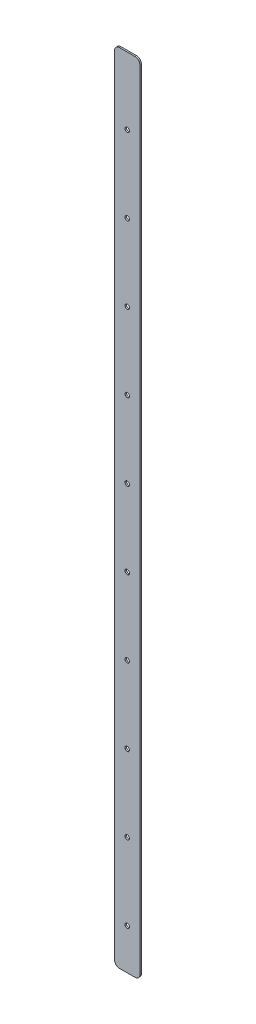
ISO-10303-21;
HEADER;
FILE_DESCRIPTION(('STEP AP214'),'2;1');
FILE_NAME('part.step','',(''),(''),'','','');
FILE_SCHEMA(('AUTOMOTIVE_DESIGN { 1 0 10303 214 1 1 1 1 }'));
ENDSEC;
DATA;
#1=APPLICATION_CONTEXT('core data for automotive mechanical design processes');
#2=APPLICATION_PROTOCOL_DEFINITION('international standard','automotive_design',2000,#1);
#3=PRODUCT_CONTEXT('',#1,'mechanical');
#4=PRODUCT('Part','Part','',(#3));
#5=PRODUCT_RELATED_PRODUCT_CATEGORY('part','',(#4));
#6=PRODUCT_DEFINITION_FORMATION('','',#4);
#7=PRODUCT_DEFINITION_CONTEXT('part definition',#1,'design');
#8=PRODUCT_DEFINITION('design','',#6,#7);
#9=PRODUCT_DEFINITION_SHAPE('','',#8);
#10=(LENGTH_UNIT() NAMED_UNIT(*) SI_UNIT(.MILLI.,.METRE.));
#11=(NAMED_UNIT(*) PLANE_ANGLE_UNIT() SI_UNIT($,.RADIAN.));
#12=(NAMED_UNIT(*) SI_UNIT($,.STERADIAN.) SOLID_ANGLE_UNIT());
#13=UNCERTAINTY_MEASURE_WITH_UNIT(LENGTH_MEASURE(1.E-05),#10,'distance_accuracy_value','');
#14=(GEOMETRIC_REPRESENTATION_CONTEXT(3) GLOBAL_UNCERTAINTY_ASSIGNED_CONTEXT((#13)) GLOBAL_UNIT_ASSIGNED_CONTEXT((#10,
#11,#12)) REPRESENTATION_CONTEXT('',''));
#15=CARTESIAN_POINT('',(0.,0.,0.));
#16=DIRECTION('',(0.,0.,1.));
#17=DIRECTION('',(1.,0.,0.));
#18=AXIS2_PLACEMENT_3D('',#15,#16,#17);
#19=CARTESIAN_POINT('',(0.,649.,-7.));
#20=DIRECTION('',(0.,0.,1.));
#21=DIRECTION('',(1.,0.,0.));
#22=AXIS2_PLACEMENT_3D('',#19,#20,#21);
#23=CYLINDRICAL_SURFACE('',#22,4.39999999999999);
#24=CARTESIAN_POINT('',(0.,649.,0.));
#25=DIRECTION('',(0.,0.,-1.));
#26=DIRECTION('',(-1.,0.,0.));
#27=AXIS2_PLACEMENT_3D('',#24,#25,#26);
#28=CIRCLE('',#27,4.39999999999999);
#29=CARTESIAN_POINT('',(-4.39999999999999,649.,0.));
#30=VERTEX_POINT('',#29);
#31=EDGE_CURVE('E48',#30,#30,#28,.T.);
#32=ORIENTED_EDGE('',*,*,#31,.T.);
#33=EDGE_LOOP('',(#32));
#34=FACE_BOUND('',#33,.T.);
#35=CARTESIAN_POINT('',(0.,649.,3.));
#36=DIRECTION('',(0.,0.,1.));
#37=DIRECTION('',(1.,0.,0.));
#38=AXIS2_PLACEMENT_3D('',#35,#36,#37);
#39=CIRCLE('',#38,4.39999999999999);
#40=CARTESIAN_POINT('',(4.39999999999999,649.,3.));
#41=VERTEX_POINT('',#40);
#42=EDGE_CURVE('E11',#41,#41,#39,.T.);
#43=ORIENTED_EDGE('',*,*,#42,.T.);
#44=EDGE_LOOP('',(#43));
#45=FACE_BOUND('',#44,.T.);
#46=ADVANCED_FACE('F41',(#34,#45),#23,.F.);
#47=CARTESIAN_POINT('',(0.,499.,-7.));
#48=DIRECTION('',(0.,0.,1.));
#49=DIRECTION('',(1.,0.,0.));
#50=AXIS2_PLACEMENT_3D('',#47,#48,#49);
#51=CYLINDRICAL_SURFACE('',#50,4.39999999999999);
#52=CARTESIAN_POINT('',(0.,499.,0.));
#53=DIRECTION('',(0.,0.,-1.));
#54=DIRECTION('',(-1.,0.,0.));
#55=AXIS2_PLACEMENT_3D('',#52,#53,#54);
#56=CIRCLE('',#55,4.39999999999999);
#57=CARTESIAN_POINT('',(-4.39999999999999,499.,0.));
#58=VERTEX_POINT('',#57);
#59=EDGE_CURVE('E210',#58,#58,#56,.T.);
#60=ORIENTED_EDGE('',*,*,#59,.T.);
#61=EDGE_LOOP('',(#60));
#62=FACE_BOUND('',#61,.T.);
#63=CARTESIAN_POINT('',(0.,499.,3.));
#64=DIRECTION('',(0.,0.,1.));
#65=DIRECTION('',(1.,0.,0.));
#66=AXIS2_PLACEMENT_3D('',#63,#64,#65);
#67=CIRCLE('',#66,4.39999999999999);
#68=CARTESIAN_POINT('',(4.39999999999999,499.,3.));
#69=VERTEX_POINT('',#68);
#70=EDGE_CURVE('E213',#69,#69,#67,.T.);
#71=ORIENTED_EDGE('',*,*,#70,.T.);
#72=EDGE_LOOP('',(#71));
#73=FACE_BOUND('',#72,.T.);
#74=ADVANCED_FACE('F238',(#62,#73),#51,.F.);
#75=CARTESIAN_POINT('',(0.,349.,-7.));
#76=DIRECTION('',(0.,0.,1.));
#77=DIRECTION('',(1.,0.,0.));
#78=AXIS2_PLACEMENT_3D('',#75,#76,#77);
#79=CYLINDRICAL_SURFACE('',#78,4.39999999999999);
#80=CARTESIAN_POINT('',(0.,349.,0.));
#81=DIRECTION('',(0.,0.,-1.));
#82=DIRECTION('',(-1.,0.,0.));
#83=AXIS2_PLACEMENT_3D('',#80,#81,#82);
#84=CIRCLE('',#83,4.39999999999999);
#85=CARTESIAN_POINT('',(-4.39999999999999,349.,0.));
#86=VERTEX_POINT('',#85);
#87=EDGE_CURVE('E204',#86,#86,#84,.T.);
#88=ORIENTED_EDGE('',*,*,#87,.T.);
#89=EDGE_LOOP('',(#88));
#90=FACE_BOUND('',#89,.T.);
#91=CARTESIAN_POINT('',(0.,349.,3.));
#92=DIRECTION('',(0.,0.,1.));
#93=DIRECTION('',(1.,0.,0.));
#94=AXIS2_PLACEMENT_3D('',#91,#92,#93);
#95=CIRCLE('',#94,4.39999999999999);
#96=CARTESIAN_POINT('',(4.39999999999999,349.,3.));
#97=VERTEX_POINT('',#96);
#98=EDGE_CURVE('E207',#97,#97,#95,.T.);
#99=ORIENTED_EDGE('',*,*,#98,.T.);
#100=EDGE_LOOP('',(#99));
#101=FACE_BOUND('',#100,.T.);
#102=ADVANCED_FACE('F243',(#90,#101),#79,.F.);
#103=CARTESIAN_POINT('',(0.,199.,-7.));
#104=DIRECTION('',(0.,0.,1.));
#105=DIRECTION('',(1.,0.,0.));
#106=AXIS2_PLACEMENT_3D('',#103,#104,#105);
#107=CYLINDRICAL_SURFACE('',#106,4.39999999999999);
#108=CARTESIAN_POINT('',(0.,199.,0.));
#109=DIRECTION('',(0.,0.,-1.));
#110=DIRECTION('',(-1.,0.,0.));
#111=AXIS2_PLACEMENT_3D('',#108,#109,#110);
#112=CIRCLE('',#111,4.39999999999999);
#113=CARTESIAN_POINT('',(-4.39999999999999,199.,0.));
#114=VERTEX_POINT('',#113);
#115=EDGE_CURVE('E198',#114,#114,#112,.T.);
#116=ORIENTED_EDGE('',*,*,#115,.T.);
#117=EDGE_LOOP('',(#116));
#118=FACE_BOUND('',#117,.T.);
#119=CARTESIAN_POINT('',(0.,199.,3.));
#120=DIRECTION('',(0.,0.,1.));
#121=DIRECTION('',(1.,0.,0.));
#122=AXIS2_PLACEMENT_3D('',#119,#120,#121);
#123=CIRCLE('',#122,4.39999999999999);
#124=CARTESIAN_POINT('',(4.39999999999999,199.,3.));
#125=VERTEX_POINT('',#124);
#126=EDGE_CURVE('E201',#125,#125,#123,.T.);
#127=ORIENTED_EDGE('',*,*,#126,.T.);
#128=EDGE_LOOP('',(#127));
#129=FACE_BOUND('',#128,.T.);
#130=ADVANCED_FACE('F248',(#118,#129),#107,.F.);
#131=CARTESIAN_POINT('',(0.,48.9999999999999,-7.));
#132=DIRECTION('',(0.,0.,1.));
#133=DIRECTION('',(1.,0.,0.));
#134=AXIS2_PLACEMENT_3D('',#131,#132,#133);
#135=CYLINDRICAL_SURFACE('',#134,4.39999999999999);
#136=CARTESIAN_POINT('',(0.,48.9999999999999,0.));
#137=DIRECTION('',(0.,0.,-1.));
#138=DIRECTION('',(-1.,0.,0.));
#139=AXIS2_PLACEMENT_3D('',#136,#137,#138);
#140=CIRCLE('',#139,4.39999999999999);
#141=CARTESIAN_POINT('',(-4.39999999999999,48.9999999999999,0.));
#142=VERTEX_POINT('',#141);
#143=EDGE_CURVE('E192',#142,#142,#140,.T.);
#144=ORIENTED_EDGE('',*,*,#143,.T.);
#145=EDGE_LOOP('',(#144));
#146=FACE_BOUND('',#145,.T.);
#147=CARTESIAN_POINT('',(0.,48.9999999999999,3.));
#148=DIRECTION('',(0.,0.,1.));
#149=DIRECTION('',(1.,0.,0.));
#150=AXIS2_PLACEMENT_3D('',#147,#148,#149);
#151=CIRCLE('',#150,4.39999999999999);
#152=CARTESIAN_POINT('',(4.39999999999999,48.9999999999999,3.));
#153=VERTEX_POINT('',#152);
#154=EDGE_CURVE('E195',#153,#153,#151,.T.);
#155=ORIENTED_EDGE('',*,*,#154,.T.);
#156=EDGE_LOOP('',(#155));
#157=FACE_BOUND('',#156,.T.);
#158=ADVANCED_FACE('F255',(#146,#157),#135,.F.);
#159=CARTESIAN_POINT('',(0.,-101.,-7.));
#160=DIRECTION('',(0.,0.,1.));
#161=DIRECTION('',(1.,0.,0.));
#162=AXIS2_PLACEMENT_3D('',#159,#160,#161);
#163=CYLINDRICAL_SURFACE('',#162,4.39999999999999);
#164=CARTESIAN_POINT('',(0.,-101.,0.));
#165=DIRECTION('',(0.,0.,-1.));
#166=DIRECTION('',(-1.,0.,0.));
#167=AXIS2_PLACEMENT_3D('',#164,#165,#166);
#168=CIRCLE('',#167,4.39999999999999);
#169=CARTESIAN_POINT('',(-4.39999999999999,-101.,0.));
#170=VERTEX_POINT('',#169);
#171=EDGE_CURVE('E186',#170,#170,#168,.T.);
#172=ORIENTED_EDGE('',*,*,#171,.T.);
#173=EDGE_LOOP('',(#172));
#174=FACE_BOUND('',#173,.T.);
#175=CARTESIAN_POINT('',(0.,-101.,3.));
#176=DIRECTION('',(0.,0.,1.));
#177=DIRECTION('',(1.,0.,0.));
#178=AXIS2_PLACEMENT_3D('',#175,#176,#177);
#179=CIRCLE('',#178,4.39999999999999);
#180=CARTESIAN_POINT('',(4.39999999999999,-101.,3.));
#181=VERTEX_POINT('',#180);
#182=EDGE_CURVE('E189',#181,#181,#179,.T.);
#183=ORIENTED_EDGE('',*,*,#182,.T.);
#184=EDGE_LOOP('',(#183));
#185=FACE_BOUND('',#184,.T.);
#186=ADVANCED_FACE('F259',(#174,#185),#163,.F.);
#187=CARTESIAN_POINT('',(0.,-251.,-7.));
#188=DIRECTION('',(0.,0.,1.));
#189=DIRECTION('',(1.,0.,0.));
#190=AXIS2_PLACEMENT_3D('',#187,#188,#189);
#191=CYLINDRICAL_SURFACE('',#190,4.39999999999999);
#192=CARTESIAN_POINT('',(0.,-251.,0.));
#193=DIRECTION('',(0.,0.,-1.));
#194=DIRECTION('',(-1.,0.,0.));
#195=AXIS2_PLACEMENT_3D('',#192,#193,#194);
#196=CIRCLE('',#195,4.39999999999999);
#197=CARTESIAN_POINT('',(-4.39999999999999,-251.,0.));
#198=VERTEX_POINT('',#197);
#199=EDGE_CURVE('E180',#198,#198,#196,.T.);
#200=ORIENTED_EDGE('',*,*,#199,.T.);
#201=EDGE_LOOP('',(#200));
#202=FACE_BOUND('',#201,.T.);
#203=CARTESIAN_POINT('',(0.,-251.,3.));
#204=DIRECTION('',(0.,0.,1.));
#205=DIRECTION('',(1.,0.,0.));
#206=AXIS2_PLACEMENT_3D('',#203,#204,#205);
#207=CIRCLE('',#206,4.39999999999999);
#208=CARTESIAN_POINT('',(4.39999999999999,-251.,3.));
#209=VERTEX_POINT('',#208);
#210=EDGE_CURVE('E183',#209,#209,#207,.T.);
#211=ORIENTED_EDGE('',*,*,#210,.T.);
#212=EDGE_LOOP('',(#211));
#213=FACE_BOUND('',#212,.T.);
#214=ADVANCED_FACE('F263',(#202,#213),#191,.F.);
#215=CARTESIAN_POINT('',(0.,-401.,-7.));
#216=DIRECTION('',(0.,0.,1.));
#217=DIRECTION('',(1.,0.,0.));
#218=AXIS2_PLACEMENT_3D('',#215,#216,#217);
#219=CYLINDRICAL_SURFACE('',#218,4.39999999999999);
#220=CARTESIAN_POINT('',(0.,-401.,0.));
#221=DIRECTION('',(0.,0.,-1.));
#222=DIRECTION('',(-1.,0.,0.));
#223=AXIS2_PLACEMENT_3D('',#220,#221,#222);
#224=CIRCLE('',#223,4.39999999999999);
#225=CARTESIAN_POINT('',(-4.39999999999999,-401.,0.));
#226=VERTEX_POINT('',#225);
#227=EDGE_CURVE('E173',#226,#226,#224,.T.);
#228=ORIENTED_EDGE('',*,*,#227,.T.);
#229=EDGE_LOOP('',(#228));
#230=FACE_BOUND('',#229,.T.);
#231=CARTESIAN_POINT('',(0.,-401.,3.));
#232=DIRECTION('',(0.,0.,1.));
#233=DIRECTION('',(1.,0.,0.));
#234=AXIS2_PLACEMENT_3D('',#231,#232,#233);
#235=CIRCLE('',#234,4.39999999999999);
#236=CARTESIAN_POINT('',(4.39999999999999,-401.,3.));
#237=VERTEX_POINT('',#236);
#238=EDGE_CURVE('E177',#237,#237,#235,.T.);
#239=ORIENTED_EDGE('',*,*,#238,.T.);
#240=EDGE_LOOP('',(#239));
#241=FACE_BOUND('',#240,.T.);
#242=ADVANCED_FACE('F267',(#230,#241),#219,.F.);
#243=CARTESIAN_POINT('',(25.,-781.,3.));
#244=DIRECTION('',(-1.,0.,0.));
#245=DIRECTION('',(0.,0.,1.));
#246=AXIS2_PLACEMENT_3D('',#243,#244,#245);
#247=PLANE('',#246);
#248=DIRECTION('',(0.,1.,0.));
#249=VECTOR('',#248,1.);
#250=CARTESIAN_POINT('',(25.,-781.,3.));
#251=LINE('',#250,#249);
#252=CARTESIAN_POINT('',(25.,-771.,3.));
#253=VERTEX_POINT('',#252);
#254=CARTESIAN_POINT('',(25.,771.,3.));
#255=VERTEX_POINT('',#254);
#256=EDGE_CURVE('E127',#253,#255,#251,.T.);
#257=ORIENTED_EDGE('',*,*,#256,.F.);
#258=DIRECTION('',(0.,0.,-1.));
#259=VECTOR('',#258,1.);
#260=CARTESIAN_POINT('',(25.,-771.,3.));
#261=LINE('',#260,#259);
#262=CARTESIAN_POINT('',(25.,-771.,0.));
#263=VERTEX_POINT('',#262);
#264=EDGE_CURVE('E111',#253,#263,#261,.T.);
#265=ORIENTED_EDGE('',*,*,#264,.T.);
#266=DIRECTION('',(0.,1.,0.));
#267=VECTOR('',#266,1.);
#268=CARTESIAN_POINT('',(25.,-781.,0.));
#269=LINE('',#268,#267);
#270=CARTESIAN_POINT('',(25.,771.,0.));
#271=VERTEX_POINT('',#270);
#272=EDGE_CURVE('E124',#263,#271,#269,.T.);
#273=ORIENTED_EDGE('',*,*,#272,.T.);
#274=DIRECTION('',(0.,0.,-1.));
#275=VECTOR('',#274,1.);
#276=CARTESIAN_POINT('',(25.,771.,3.));
#277=LINE('',#276,#275);
#278=EDGE_CURVE('E129',#271,#255,#277,.F.);
#279=ORIENTED_EDGE('',*,*,#278,.T.);
#280=EDGE_LOOP('',(#257,#265,#273,#279));
#281=FACE_BOUND('',#280,.T.);
#282=ADVANCED_FACE('F123',(#281),#247,.F.);
#283=CARTESIAN_POINT('',(-25.,781.,3.));
#284=DIRECTION('',(0.,-1.,0.));
#285=DIRECTION('',(0.,0.,-1.));
#286=AXIS2_PLACEMENT_3D('',#283,#284,#285);
#287=PLANE('',#286);
#288=DIRECTION('',(-1.,0.,0.));
#289=VECTOR('',#288,1.);
#290=CARTESIAN_POINT('',(-25.,781.,0.));
#291=LINE('',#290,#289);
#292=CARTESIAN_POINT('',(15.,781.,0.));
#293=VERTEX_POINT('',#292);
#294=CARTESIAN_POINT('',(-15.,781.,0.));
#295=VERTEX_POINT('',#294);
#296=EDGE_CURVE('E134',#293,#295,#291,.T.);
#297=ORIENTED_EDGE('',*,*,#296,.T.);
#298=DIRECTION('',(0.,0.,-1.));
#299=VECTOR('',#298,1.);
#300=CARTESIAN_POINT('',(-15.,781.,3.));
#301=LINE('',#300,#299);
#302=CARTESIAN_POINT('',(-15.,781.,3.));
#303=VERTEX_POINT('',#302);
#304=EDGE_CURVE('E172',#295,#303,#301,.F.);
#305=ORIENTED_EDGE('',*,*,#304,.T.);
#306=DIRECTION('',(-1.,0.,0.));
#307=VECTOR('',#306,1.);
#308=CARTESIAN_POINT('',(-25.,781.,3.));
#309=LINE('',#308,#307);
#310=CARTESIAN_POINT('',(15.,781.,3.));
#311=VERTEX_POINT('',#310);
#312=EDGE_CURVE('E304',#311,#303,#309,.T.);
#313=ORIENTED_EDGE('',*,*,#312,.F.);
#314=DIRECTION('',(0.,0.,-1.));
#315=VECTOR('',#314,1.);
#316=CARTESIAN_POINT('',(15.,781.,3.));
#317=LINE('',#316,#315);
#318=EDGE_CURVE('E169',#311,#293,#317,.T.);
#319=ORIENTED_EDGE('',*,*,#318,.T.);
#320=EDGE_LOOP('',(#297,#305,#313,#319));
#321=FACE_BOUND('',#320,.T.);
#322=ADVANCED_FACE('F286',(#321),#287,.F.);
#323=CARTESIAN_POINT('',(-25.,-781.,3.));
#324=DIRECTION('',(1.,0.,0.));
#325=DIRECTION('',(0.,0.,-1.));
#326=AXIS2_PLACEMENT_3D('',#323,#324,#325);
#327=PLANE('',#326);
#328=DIRECTION('',(0.,-1.,0.));
#329=VECTOR('',#328,1.);
#330=CARTESIAN_POINT('',(-25.,-781.,0.));
#331=LINE('',#330,#329);
#332=CARTESIAN_POINT('',(-25.,771.,0.));
#333=VERTEX_POINT('',#332);
#334=CARTESIAN_POINT('',(-25.,-771.,0.));
#335=VERTEX_POINT('',#334);
#336=EDGE_CURVE('E138',#333,#335,#331,.T.);
#337=ORIENTED_EDGE('',*,*,#336,.T.);
#338=DIRECTION('',(0.,0.,-1.));
#339=VECTOR('',#338,1.);
#340=CARTESIAN_POINT('',(-25.,-771.,3.));
#341=LINE('',#340,#339);
#342=CARTESIAN_POINT('',(-25.,-771.,3.));
#343=VERTEX_POINT('',#342);
#344=EDGE_CURVE('E55',#335,#343,#341,.F.);
#345=ORIENTED_EDGE('',*,*,#344,.T.);
#346=DIRECTION('',(0.,-1.,0.));
#347=VECTOR('',#346,1.);
#348=CARTESIAN_POINT('',(-25.,-781.,3.));
#349=LINE('',#348,#347);
#350=CARTESIAN_POINT('',(-25.,771.,3.));
#351=VERTEX_POINT('',#350);
#352=EDGE_CURVE('E303',#351,#343,#349,.T.);
#353=ORIENTED_EDGE('',*,*,#352,.F.);
#354=DIRECTION('',(0.,0.,-1.));
#355=VECTOR('',#354,1.);
#356=CARTESIAN_POINT('',(-25.,771.,3.));
#357=LINE('',#356,#355);
#358=EDGE_CURVE('E165',#351,#333,#357,.T.);
#359=ORIENTED_EDGE('',*,*,#358,.T.);
#360=EDGE_LOOP('',(#337,#345,#353,#359));
#361=FACE_BOUND('',#360,.T.);
#362=ADVANCED_FACE('F289',(#361),#327,.F.);
#363=CARTESIAN_POINT('',(-25.,-781.,3.));
#364=DIRECTION('',(0.,1.,0.));
#365=DIRECTION('',(0.,0.,1.));
#366=AXIS2_PLACEMENT_3D('',#363,#364,#365);
#367=PLANE('',#366);
#368=DIRECTION('',(1.,0.,0.));
#369=VECTOR('',#368,1.);
#370=CARTESIAN_POINT('',(-25.,-781.,0.));
#371=LINE('',#370,#369);
#372=CARTESIAN_POINT('',(-15.,-781.,0.));
#373=VERTEX_POINT('',#372);
#374=CARTESIAN_POINT('',(15.,-781.,0.));
#375=VERTEX_POINT('',#374);
#376=EDGE_CURVE('E148',#373,#375,#371,.T.);
#377=ORIENTED_EDGE('',*,*,#376,.T.);
#378=DIRECTION('',(0.,0.,-1.));
#379=VECTOR('',#378,1.);
#380=CARTESIAN_POINT('',(15.,-781.,3.));
#381=LINE('',#380,#379);
#382=CARTESIAN_POINT('',(15.,-781.,3.));
#383=VERTEX_POINT('',#382);
#384=EDGE_CURVE('E112',#375,#383,#381,.F.);
#385=ORIENTED_EDGE('',*,*,#384,.T.);
#386=DIRECTION('',(1.,0.,0.));
#387=VECTOR('',#386,1.);
#388=CARTESIAN_POINT('',(-25.,-781.,3.));
#389=LINE('',#388,#387);
#390=CARTESIAN_POINT('',(-15.,-781.,3.));
#391=VERTEX_POINT('',#390);
#392=EDGE_CURVE('E144',#391,#383,#389,.T.);
#393=ORIENTED_EDGE('',*,*,#392,.F.);
#394=DIRECTION('',(0.,0.,-1.));
#395=VECTOR('',#394,1.);
#396=CARTESIAN_POINT('',(-15.,-781.,3.));
#397=LINE('',#396,#395);
#398=EDGE_CURVE('E117',#391,#373,#397,.T.);
#399=ORIENTED_EDGE('',*,*,#398,.T.);
#400=EDGE_LOOP('',(#377,#385,#393,#399));
#401=FACE_BOUND('',#400,.T.);
#402=ADVANCED_FACE('F231',(#401),#367,.F.);
#403=CARTESIAN_POINT('',(0.,0.,3.));
#404=DIRECTION('',(0.,0.,-1.));
#405=DIRECTION('',(-1.,0.,0.));
#406=AXIS2_PLACEMENT_3D('',#403,#404,#405);
#407=PLANE('',#406);
#408=CARTESIAN_POINT('',(0.,-551.,3.));
#409=DIRECTION('',(0.,0.,1.));
#410=DIRECTION('',(1.,0.,0.));
#411=AXIS2_PLACEMENT_3D('',#408,#409,#410);
#412=CIRCLE('',#411,4.39999999999999);
#413=CARTESIAN_POINT('',(4.39999999999999,-551.,3.));
#414=VERTEX_POINT('',#413);
#415=EDGE_CURVE('E310',#414,#414,#412,.T.);
#416=ORIENTED_EDGE('',*,*,#415,.F.);
#417=EDGE_LOOP('',(#416));
#418=FACE_BOUND('',#417,.T.);
#419=CARTESIAN_POINT('',(0.,-701.,3.));
#420=DIRECTION('',(0.,0.,1.));
#421=DIRECTION('',(1.,0.,0.));
#422=AXIS2_PLACEMENT_3D('',#419,#420,#421);
#423=CIRCLE('',#422,4.39999999999999);
#424=CARTESIAN_POINT('',(4.39999999999999,-701.,3.));
#425=VERTEX_POINT('',#424);
#426=EDGE_CURVE('E141',#425,#425,#423,.T.);
#427=ORIENTED_EDGE('',*,*,#426,.F.);
#428=EDGE_LOOP('',(#427));
#429=FACE_BOUND('',#428,.T.);
#430=ORIENTED_EDGE('',*,*,#392,.T.);
#431=CARTESIAN_POINT('',(15.,-771.,3.));
#432=DIRECTION('',(0.,0.,-1.));
#433=DIRECTION('',(-1.,0.,0.));
#434=AXIS2_PLACEMENT_3D('',#431,#432,#433);
#435=CIRCLE('',#434,10.);
#436=EDGE_CURVE('E163',#383,#253,#435,.F.);
#437=ORIENTED_EDGE('',*,*,#436,.T.);
#438=ORIENTED_EDGE('',*,*,#256,.T.);
#439=CARTESIAN_POINT('',(15.,771.,3.));
#440=DIRECTION('',(0.,0.,-1.));
#441=DIRECTION('',(-1.,0.,0.));
#442=AXIS2_PLACEMENT_3D('',#439,#440,#441);
#443=CIRCLE('',#442,10.);
#444=EDGE_CURVE('E158',#255,#311,#443,.F.);
#445=ORIENTED_EDGE('',*,*,#444,.T.);
#446=ORIENTED_EDGE('',*,*,#312,.T.);
#447=CARTESIAN_POINT('',(-15.,771.,3.));
#448=DIRECTION('',(0.,0.,-1.));
#449=DIRECTION('',(-1.,0.,0.));
#450=AXIS2_PLACEMENT_3D('',#447,#448,#449);
#451=CIRCLE('',#450,10.);
#452=EDGE_CURVE('E62',#303,#351,#451,.F.);
#453=ORIENTED_EDGE('',*,*,#452,.T.);
#454=ORIENTED_EDGE('',*,*,#352,.T.);
#455=CARTESIAN_POINT('',(-15.,-771.,3.));
#456=DIRECTION('',(0.,0.,-1.));
#457=DIRECTION('',(-1.,0.,0.));
#458=AXIS2_PLACEMENT_3D('',#455,#456,#457);
#459=CIRCLE('',#458,10.);
#460=EDGE_CURVE('E161',#343,#391,#459,.F.);
#461=ORIENTED_EDGE('',*,*,#460,.T.);
#462=EDGE_LOOP('',(#430,#437,#438,#445,#446,#453,#454,#461));
#463=FACE_BOUND('',#462,.T.);
#464=ORIENTED_EDGE('',*,*,#238,.F.);
#465=EDGE_LOOP('',(#464));
#466=FACE_BOUND('',#465,.T.);
#467=ORIENTED_EDGE('',*,*,#210,.F.);
#468=EDGE_LOOP('',(#467));
#469=FACE_BOUND('',#468,.T.);
#470=ORIENTED_EDGE('',*,*,#182,.F.);
#471=EDGE_LOOP('',(#470));
#472=FACE_BOUND('',#471,.T.);
#473=ORIENTED_EDGE('',*,*,#154,.F.);
#474=EDGE_LOOP('',(#473));
#475=FACE_BOUND('',#474,.T.);
#476=ORIENTED_EDGE('',*,*,#126,.F.);
#477=EDGE_LOOP('',(#476));
#478=FACE_BOUND('',#477,.T.);
#479=ORIENTED_EDGE('',*,*,#98,.F.);
#480=EDGE_LOOP('',(#479));
#481=FACE_BOUND('',#480,.T.);
#482=ORIENTED_EDGE('',*,*,#70,.F.);
#483=EDGE_LOOP('',(#482));
#484=FACE_BOUND('',#483,.T.);
#485=ORIENTED_EDGE('',*,*,#42,.F.);
#486=EDGE_LOOP('',(#485));
#487=FACE_BOUND('',#486,.T.);
#488=ADVANCED_FACE('F221',(#418,#429,#463,#466,#469,#472,#475,#478,#481,#484,#487),#407,.F.);
#489=CARTESIAN_POINT('',(0.,0.,0.));
#490=DIRECTION('',(0.,0.,-1.));
#491=DIRECTION('',(-1.,0.,0.));
#492=AXIS2_PLACEMENT_3D('',#489,#490,#491);
#493=PLANE('',#492);
#494=CARTESIAN_POINT('',(0.,-551.,0.));
#495=DIRECTION('',(0.,0.,-1.));
#496=DIRECTION('',(-1.,0.,0.));
#497=AXIS2_PLACEMENT_3D('',#494,#495,#496);
#498=CIRCLE('',#497,4.39999999999999);
#499=CARTESIAN_POINT('',(-4.39999999999999,-551.,0.));
#500=VERTEX_POINT('',#499);
#501=EDGE_CURVE('E313',#500,#500,#498,.T.);
#502=ORIENTED_EDGE('',*,*,#501,.F.);
#503=EDGE_LOOP('',(#502));
#504=FACE_BOUND('',#503,.T.);
#505=CARTESIAN_POINT('',(0.,-701.,0.));
#506=DIRECTION('',(0.,0.,-1.));
#507=DIRECTION('',(-1.,0.,0.));
#508=AXIS2_PLACEMENT_3D('',#505,#506,#507);
#509=CIRCLE('',#508,4.39999999999999);
#510=CARTESIAN_POINT('',(-4.39999999999999,-701.,0.));
#511=VERTEX_POINT('',#510);
#512=EDGE_CURVE('E135',#511,#511,#509,.T.);
#513=ORIENTED_EDGE('',*,*,#512,.F.);
#514=EDGE_LOOP('',(#513));
#515=FACE_BOUND('',#514,.T.);
#516=ORIENTED_EDGE('',*,*,#272,.F.);
#517=CARTESIAN_POINT('',(15.,-771.,0.));
#518=DIRECTION('',(0.,0.,-1.));
#519=DIRECTION('',(-1.,0.,0.));
#520=AXIS2_PLACEMENT_3D('',#517,#518,#519);
#521=CIRCLE('',#520,10.);
#522=EDGE_CURVE('E107',#263,#375,#521,.T.);
#523=ORIENTED_EDGE('',*,*,#522,.T.);
#524=ORIENTED_EDGE('',*,*,#376,.F.);
#525=CARTESIAN_POINT('',(-15.,-771.,0.));
#526=DIRECTION('',(0.,0.,-1.));
#527=DIRECTION('',(-1.,0.,0.));
#528=AXIS2_PLACEMENT_3D('',#525,#526,#527);
#529=CIRCLE('',#528,10.);
#530=EDGE_CURVE('E118',#373,#335,#529,.T.);
#531=ORIENTED_EDGE('',*,*,#530,.T.);
#532=ORIENTED_EDGE('',*,*,#336,.F.);
#533=CARTESIAN_POINT('',(-15.,771.,0.));
#534=DIRECTION('',(0.,0.,-1.));
#535=DIRECTION('',(-1.,0.,0.));
#536=AXIS2_PLACEMENT_3D('',#533,#534,#535);
#537=CIRCLE('',#536,10.);
#538=EDGE_CURVE('E152',#333,#295,#537,.T.);
#539=ORIENTED_EDGE('',*,*,#538,.T.);
#540=ORIENTED_EDGE('',*,*,#296,.F.);
#541=CARTESIAN_POINT('',(15.,771.,0.));
#542=DIRECTION('',(0.,0.,-1.));
#543=DIRECTION('',(-1.,0.,0.));
#544=AXIS2_PLACEMENT_3D('',#541,#542,#543);
#545=CIRCLE('',#544,10.);
#546=EDGE_CURVE('E128',#293,#271,#545,.T.);
#547=ORIENTED_EDGE('',*,*,#546,.T.);
#548=EDGE_LOOP('',(#516,#523,#524,#531,#532,#539,#540,#547));
#549=FACE_BOUND('',#548,.T.);
#550=ORIENTED_EDGE('',*,*,#227,.F.);
#551=EDGE_LOOP('',(#550));
#552=FACE_BOUND('',#551,.T.);
#553=ORIENTED_EDGE('',*,*,#199,.F.);
#554=EDGE_LOOP('',(#553));
#555=FACE_BOUND('',#554,.T.);
#556=ORIENTED_EDGE('',*,*,#171,.F.);
#557=EDGE_LOOP('',(#556));
#558=FACE_BOUND('',#557,.T.);
#559=ORIENTED_EDGE('',*,*,#143,.F.);
#560=EDGE_LOOP('',(#559));
#561=FACE_BOUND('',#560,.T.);
#562=ORIENTED_EDGE('',*,*,#115,.F.);
#563=EDGE_LOOP('',(#562));
#564=FACE_BOUND('',#563,.T.);
#565=ORIENTED_EDGE('',*,*,#87,.F.);
#566=EDGE_LOOP('',(#565));
#567=FACE_BOUND('',#566,.T.);
#568=ORIENTED_EDGE('',*,*,#59,.F.);
#569=EDGE_LOOP('',(#568));
#570=FACE_BOUND('',#569,.T.);
#571=ORIENTED_EDGE('',*,*,#31,.F.);
#572=EDGE_LOOP('',(#571));
#573=FACE_BOUND('',#572,.T.);
#574=ADVANCED_FACE('F131',(#504,#515,#549,#552,#555,#558,#561,#564,#567,#570,#573),#493,.T.);
#575=CARTESIAN_POINT('',(15.,-771.,3.));
#576=DIRECTION('',(0.,0.,-1.));
#577=DIRECTION('',(-1.,0.,0.));
#578=AXIS2_PLACEMENT_3D('',#575,#576,#577);
#579=CYLINDRICAL_SURFACE('',#578,10.);
#580=ORIENTED_EDGE('',*,*,#436,.F.);
#581=ORIENTED_EDGE('',*,*,#384,.F.);
#582=ORIENTED_EDGE('',*,*,#522,.F.);
#583=ORIENTED_EDGE('',*,*,#264,.F.);
#584=EDGE_LOOP('',(#580,#581,#582,#583));
#585=FACE_BOUND('',#584,.T.);
#586=ADVANCED_FACE('F110',(#585),#579,.T.);
#587=CARTESIAN_POINT('',(-15.,-771.,3.));
#588=DIRECTION('',(0.,0.,-1.));
#589=DIRECTION('',(-1.,0.,0.));
#590=AXIS2_PLACEMENT_3D('',#587,#588,#589);
#591=CYLINDRICAL_SURFACE('',#590,10.);
#592=ORIENTED_EDGE('',*,*,#460,.F.);
#593=ORIENTED_EDGE('',*,*,#344,.F.);
#594=ORIENTED_EDGE('',*,*,#530,.F.);
#595=ORIENTED_EDGE('',*,*,#398,.F.);
#596=EDGE_LOOP('',(#592,#593,#594,#595));
#597=FACE_BOUND('',#596,.T.);
#598=ADVANCED_FACE('F229',(#597),#591,.T.);
#599=CARTESIAN_POINT('',(-15.,771.,3.));
#600=DIRECTION('',(0.,0.,-1.));
#601=DIRECTION('',(-1.,0.,0.));
#602=AXIS2_PLACEMENT_3D('',#599,#600,#601);
#603=CYLINDRICAL_SURFACE('',#602,10.);
#604=ORIENTED_EDGE('',*,*,#452,.F.);
#605=ORIENTED_EDGE('',*,*,#304,.F.);
#606=ORIENTED_EDGE('',*,*,#538,.F.);
#607=ORIENTED_EDGE('',*,*,#358,.F.);
#608=EDGE_LOOP('',(#604,#605,#606,#607));
#609=FACE_BOUND('',#608,.T.);
#610=ADVANCED_FACE('F276',(#609),#603,.T.);
#611=CARTESIAN_POINT('',(15.,771.,3.));
#612=DIRECTION('',(0.,0.,-1.));
#613=DIRECTION('',(-1.,0.,0.));
#614=AXIS2_PLACEMENT_3D('',#611,#612,#613);
#615=CYLINDRICAL_SURFACE('',#614,10.);
#616=ORIENTED_EDGE('',*,*,#444,.F.);
#617=ORIENTED_EDGE('',*,*,#278,.F.);
#618=ORIENTED_EDGE('',*,*,#546,.F.);
#619=ORIENTED_EDGE('',*,*,#318,.F.);
#620=EDGE_LOOP('',(#616,#617,#618,#619));
#621=FACE_BOUND('',#620,.T.);
#622=ADVANCED_FACE('F272',(#621),#615,.T.);
#623=CARTESIAN_POINT('',(0.,-701.,-7.));
#624=DIRECTION('',(0.,0.,1.));
#625=DIRECTION('',(1.,0.,0.));
#626=AXIS2_PLACEMENT_3D('',#623,#624,#625);
#627=CYLINDRICAL_SURFACE('',#626,4.39999999999999);
#628=ORIENTED_EDGE('',*,*,#512,.T.);
#629=EDGE_LOOP('',(#628));
#630=FACE_BOUND('',#629,.T.);
#631=ORIENTED_EDGE('',*,*,#426,.T.);
#632=EDGE_LOOP('',(#631));
#633=FACE_BOUND('',#632,.T.);
#634=ADVANCED_FACE('F275',(#630,#633),#627,.F.);
#635=CARTESIAN_POINT('',(0.,-551.,-7.));
#636=DIRECTION('',(0.,0.,1.));
#637=DIRECTION('',(1.,0.,0.));
#638=AXIS2_PLACEMENT_3D('',#635,#636,#637);
#639=CYLINDRICAL_SURFACE('',#638,4.39999999999999);
#640=ORIENTED_EDGE('',*,*,#501,.T.);
#641=EDGE_LOOP('',(#640));
#642=FACE_BOUND('',#641,.T.);
#643=ORIENTED_EDGE('',*,*,#415,.T.);
#644=EDGE_LOOP('',(#643));
#645=FACE_BOUND('',#644,.T.);
#646=ADVANCED_FACE('F316',(#642,#645),#639,.F.);
#647=CLOSED_SHELL('',(#46,#74,#102,#130,#158,#186,#214,#242,#282,#322,#362,#402,#488,#574,#586,
#598,#610,#622,#634,#646));
#648=MANIFOLD_SOLID_BREP('B2',#647);
#649=ADVANCED_BREP_SHAPE_REPRESENTATION('',(#18,#648),#14);
#650=SHAPE_DEFINITION_REPRESENTATION(#9,#649);
ENDSEC;
END-ISO-10303-21;
